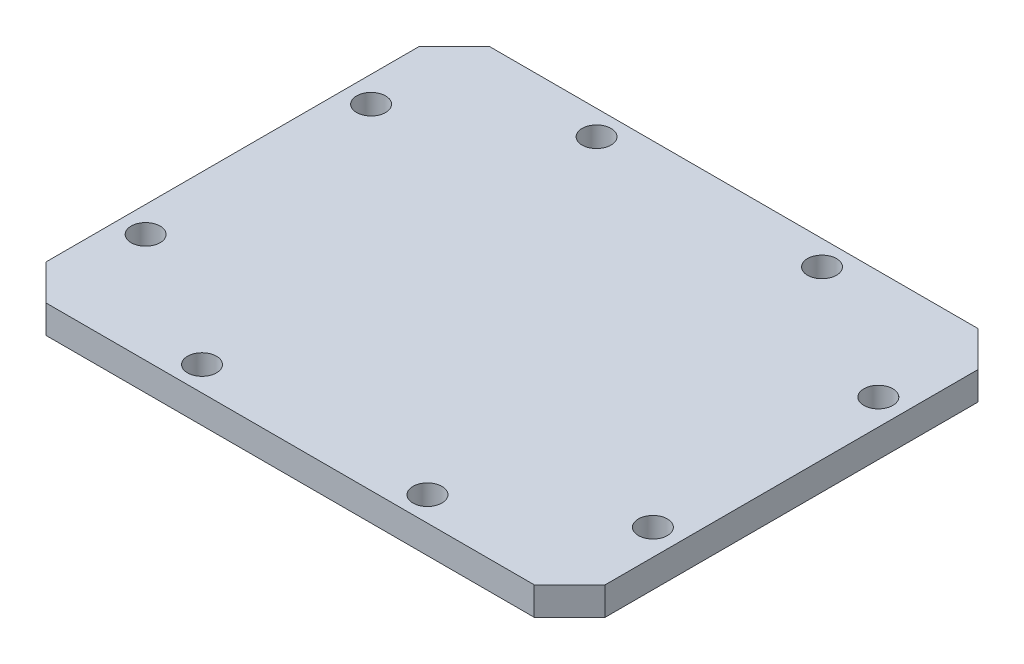
ISO-10303-21;
HEADER;
FILE_DESCRIPTION(('STEP AP214'),'2;1');
FILE_NAME('part.step','',(''),(''),'','','');
FILE_SCHEMA(('AUTOMOTIVE_DESIGN { 1 0 10303 214 1 1 1 1 }'));
ENDSEC;
DATA;
#1=APPLICATION_CONTEXT('core data for automotive mechanical design processes');
#2=APPLICATION_PROTOCOL_DEFINITION('international standard','automotive_design',2000,#1);
#3=PRODUCT_CONTEXT('',#1,'mechanical');
#4=PRODUCT('Part','Part','',(#3));
#5=PRODUCT_RELATED_PRODUCT_CATEGORY('part','',(#4));
#6=PRODUCT_DEFINITION_FORMATION('','',#4);
#7=PRODUCT_DEFINITION_CONTEXT('part definition',#1,'design');
#8=PRODUCT_DEFINITION('design','',#6,#7);
#9=PRODUCT_DEFINITION_SHAPE('','',#8);
#10=(LENGTH_UNIT() NAMED_UNIT(*) SI_UNIT(.MILLI.,.METRE.));
#11=(NAMED_UNIT(*) PLANE_ANGLE_UNIT() SI_UNIT($,.RADIAN.));
#12=(NAMED_UNIT(*) SI_UNIT($,.STERADIAN.) SOLID_ANGLE_UNIT());
#13=UNCERTAINTY_MEASURE_WITH_UNIT(LENGTH_MEASURE(1.E-05),#10,'distance_accuracy_value','');
#14=(GEOMETRIC_REPRESENTATION_CONTEXT(3) GLOBAL_UNCERTAINTY_ASSIGNED_CONTEXT((#13)) GLOBAL_UNIT_ASSIGNED_CONTEXT((#10,
#11,#12)) REPRESENTATION_CONTEXT('',''));
#15=CARTESIAN_POINT('',(0.,0.,0.));
#16=DIRECTION('',(0.,0.,1.));
#17=DIRECTION('',(1.,0.,0.));
#18=AXIS2_PLACEMENT_3D('',#15,#16,#17);
#19=CARTESIAN_POINT('',(0.,3.175,0.));
#20=DIRECTION('',(0.,1.,0.));
#21=DIRECTION('',(0.,0.,1.));
#22=AXIS2_PLACEMENT_3D('',#19,#20,#21);
#23=PLANE('',#22);
#24=CARTESIAN_POINT('',(2.925,3.175,37.7));
#25=DIRECTION('',(0.,1.,0.));
#26=DIRECTION('',(0.,0.,1.));
#27=AXIS2_PLACEMENT_3D('',#24,#25,#26);
#28=CIRCLE('',#27,1.63195);
#29=CARTESIAN_POINT('',(2.925,3.175,39.33195));
#30=VERTEX_POINT('',#29);
#31=EDGE_CURVE('E221',#30,#30,#28,.T.);
#32=ORIENTED_EDGE('',*,*,#31,.F.);
#33=EDGE_LOOP('',(#32));
#34=FACE_BOUND('',#33,.T.);
#35=CARTESIAN_POINT('',(44.2,3.175,47.225));
#36=DIRECTION('',(0.,1.,0.));
#37=DIRECTION('',(0.,0.,1.));
#38=AXIS2_PLACEMENT_3D('',#35,#36,#37);
#39=CIRCLE('',#38,1.63194999999999);
#40=CARTESIAN_POINT('',(44.2,3.175,48.85695));
#41=VERTEX_POINT('',#40);
#42=EDGE_CURVE('E209',#41,#41,#39,.T.);
#43=ORIENTED_EDGE('',*,*,#42,.F.);
#44=EDGE_LOOP('',(#43));
#45=FACE_BOUND('',#44,.T.);
#46=CARTESIAN_POINT('',(60.075,3.175,12.3));
#47=DIRECTION('',(0.,1.,0.));
#48=DIRECTION('',(0.,0.,1.));
#49=AXIS2_PLACEMENT_3D('',#46,#47,#48);
#50=CIRCLE('',#49,1.63195);
#51=CARTESIAN_POINT('',(60.075,3.175,13.93195));
#52=VERTEX_POINT('',#51);
#53=EDGE_CURVE('E197',#52,#52,#50,.T.);
#54=ORIENTED_EDGE('',*,*,#53,.F.);
#55=EDGE_LOOP('',(#54));
#56=FACE_BOUND('',#55,.T.);
#57=CARTESIAN_POINT('',(18.8,3.175,2.775));
#58=DIRECTION('',(0.,1.,0.));
#59=DIRECTION('',(0.,0.,1.));
#60=AXIS2_PLACEMENT_3D('',#57,#58,#59);
#61=CIRCLE('',#60,1.63195);
#62=CARTESIAN_POINT('',(18.8,3.175,4.40695));
#63=VERTEX_POINT('',#62);
#64=EDGE_CURVE('E135',#63,#63,#61,.T.);
#65=ORIENTED_EDGE('',*,*,#64,.F.);
#66=EDGE_LOOP('',(#65));
#67=FACE_BOUND('',#66,.T.);
#68=DIRECTION('',(-1.,0.,0.));
#69=VECTOR('',#68,1.);
#70=CARTESIAN_POINT('',(0.,3.175,0.));
#71=LINE('',#70,#69);
#72=CARTESIAN_POINT('',(59.,3.175,0.));
#73=VERTEX_POINT('',#72);
#74=CARTESIAN_POINT('',(4.,3.175,0.));
#75=VERTEX_POINT('',#74);
#76=EDGE_CURVE('E144',#73,#75,#71,.T.);
#77=ORIENTED_EDGE('',*,*,#76,.T.);
#78=DIRECTION('',(0.707106781186548,0.,-0.707106781186547));
#79=VECTOR('',#78,1.);
#80=CARTESIAN_POINT('',(2.,3.175,2.));
#81=LINE('',#80,#79);
#82=CARTESIAN_POINT('',(0.,3.175,3.99999999999999));
#83=VERTEX_POINT('',#82);
#84=EDGE_CURVE('E162',#75,#83,#81,.F.);
#85=ORIENTED_EDGE('',*,*,#84,.T.);
#86=DIRECTION('',(0.,0.,1.));
#87=VECTOR('',#86,1.);
#88=CARTESIAN_POINT('',(0.,3.175,0.));
#89=LINE('',#88,#87);
#90=CARTESIAN_POINT('',(0.,3.175,46.));
#91=VERTEX_POINT('',#90);
#92=EDGE_CURVE('E126',#83,#91,#89,.T.);
#93=ORIENTED_EDGE('',*,*,#92,.T.);
#94=DIRECTION('',(-0.707106781186547,0.,-0.707106781186548));
#95=VECTOR('',#94,1.);
#96=CARTESIAN_POINT('',(-23.,3.175,23.));
#97=LINE('',#96,#95);
#98=CARTESIAN_POINT('',(4.00000000000001,3.175,50.));
#99=VERTEX_POINT('',#98);
#100=EDGE_CURVE('E158',#91,#99,#97,.F.);
#101=ORIENTED_EDGE('',*,*,#100,.T.);
#102=DIRECTION('',(1.,0.,0.));
#103=VECTOR('',#102,1.);
#104=CARTESIAN_POINT('',(0.,3.175,50.));
#105=LINE('',#104,#103);
#106=CARTESIAN_POINT('',(59.,3.175,50.));
#107=VERTEX_POINT('',#106);
#108=EDGE_CURVE('E171',#99,#107,#105,.T.);
#109=ORIENTED_EDGE('',*,*,#108,.T.);
#110=DIRECTION('',(-0.707106781186549,0.,0.707106781186546));
#111=VECTOR('',#110,1.);
#112=CARTESIAN_POINT('',(54.4999999999999,3.175,54.5000000000001));
#113=LINE('',#112,#111);
#114=CARTESIAN_POINT('',(63.,3.175,46.));
#115=VERTEX_POINT('',#114);
#116=EDGE_CURVE('E61',#107,#115,#113,.F.);
#117=ORIENTED_EDGE('',*,*,#116,.T.);
#118=DIRECTION('',(0.,0.,-1.));
#119=VECTOR('',#118,1.);
#120=CARTESIAN_POINT('',(63.,3.175,0.));
#121=LINE('',#120,#119);
#122=CARTESIAN_POINT('',(63.,3.175,3.99999999999999));
#123=VERTEX_POINT('',#122);
#124=EDGE_CURVE('E177',#115,#123,#121,.T.);
#125=ORIENTED_EDGE('',*,*,#124,.T.);
#126=DIRECTION('',(0.707106781186547,0.,0.707106781186548));
#127=VECTOR('',#126,1.);
#128=CARTESIAN_POINT('',(29.5000000000001,3.175,-29.5));
#129=LINE('',#128,#127);
#130=EDGE_CURVE('E160',#123,#73,#129,.F.);
#131=ORIENTED_EDGE('',*,*,#130,.T.);
#132=EDGE_LOOP('',(#77,#85,#93,#101,#109,#117,#125,#131));
#133=FACE_BOUND('',#132,.T.);
#134=CARTESIAN_POINT('',(44.2,3.175,2.775));
#135=DIRECTION('',(0.,1.,0.));
#136=DIRECTION('',(0.,0.,1.));
#137=AXIS2_PLACEMENT_3D('',#134,#135,#136);
#138=CIRCLE('',#137,1.63195);
#139=CARTESIAN_POINT('',(44.2,3.175,4.40695));
#140=VERTEX_POINT('',#139);
#141=EDGE_CURVE('E192',#140,#140,#138,.T.);
#142=ORIENTED_EDGE('',*,*,#141,.F.);
#143=EDGE_LOOP('',(#142));
#144=FACE_BOUND('',#143,.T.);
#145=CARTESIAN_POINT('',(60.075,3.175,37.7));
#146=DIRECTION('',(0.,1.,0.));
#147=DIRECTION('',(0.,0.,1.));
#148=AXIS2_PLACEMENT_3D('',#145,#146,#147);
#149=CIRCLE('',#148,1.63194999999999);
#150=CARTESIAN_POINT('',(60.075,3.175,39.33195));
#151=VERTEX_POINT('',#150);
#152=EDGE_CURVE('E203',#151,#151,#149,.T.);
#153=ORIENTED_EDGE('',*,*,#152,.F.);
#154=EDGE_LOOP('',(#153));
#155=FACE_BOUND('',#154,.T.);
#156=CARTESIAN_POINT('',(18.8,3.175,47.225));
#157=DIRECTION('',(0.,1.,0.));
#158=DIRECTION('',(0.,0.,1.));
#159=AXIS2_PLACEMENT_3D('',#156,#157,#158);
#160=CIRCLE('',#159,1.63195);
#161=CARTESIAN_POINT('',(18.8,3.175,48.85695));
#162=VERTEX_POINT('',#161);
#163=EDGE_CURVE('E215',#162,#162,#160,.T.);
#164=ORIENTED_EDGE('',*,*,#163,.F.);
#165=EDGE_LOOP('',(#164));
#166=FACE_BOUND('',#165,.T.);
#167=CARTESIAN_POINT('',(2.925,3.175,12.3));
#168=DIRECTION('',(0.,1.,0.));
#169=DIRECTION('',(0.,0.,1.));
#170=AXIS2_PLACEMENT_3D('',#167,#168,#169);
#171=CIRCLE('',#170,1.63195);
#172=CARTESIAN_POINT('',(2.925,3.175,13.93195));
#173=VERTEX_POINT('',#172);
#174=EDGE_CURVE('E227',#173,#173,#171,.T.);
#175=ORIENTED_EDGE('',*,*,#174,.F.);
#176=EDGE_LOOP('',(#175));
#177=FACE_BOUND('',#176,.T.);
#178=ADVANCED_FACE('F38',(#34,#45,#56,#67,#133,#144,#155,#166,#177),#23,.T.);
#179=CARTESIAN_POINT('',(0.,0.,0.));
#180=DIRECTION('',(0.,1.,0.));
#181=DIRECTION('',(0.,0.,1.));
#182=AXIS2_PLACEMENT_3D('',#179,#180,#181);
#183=PLANE('',#182);
#184=DIRECTION('',(0.,0.,1.));
#185=VECTOR('',#184,1.);
#186=CARTESIAN_POINT('',(0.,0.,0.));
#187=LINE('',#186,#185);
#188=CARTESIAN_POINT('',(0.,0.,3.99999999999999));
#189=VERTEX_POINT('',#188);
#190=CARTESIAN_POINT('',(0.,0.,46.));
#191=VERTEX_POINT('',#190);
#192=EDGE_CURVE('E123',#189,#191,#187,.T.);
#193=ORIENTED_EDGE('',*,*,#192,.F.);
#194=DIRECTION('',(-0.707106781186548,0.,0.707106781186547));
#195=VECTOR('',#194,1.);
#196=CARTESIAN_POINT('',(0.,0.,3.99999999999999));
#197=LINE('',#196,#195);
#198=CARTESIAN_POINT('',(4.,0.,0.));
#199=VERTEX_POINT('',#198);
#200=EDGE_CURVE('E106',#189,#199,#197,.F.);
#201=ORIENTED_EDGE('',*,*,#200,.T.);
#202=DIRECTION('',(-1.,0.,0.));
#203=VECTOR('',#202,1.);
#204=CARTESIAN_POINT('',(0.,0.,0.));
#205=LINE('',#204,#203);
#206=CARTESIAN_POINT('',(59.,0.,0.));
#207=VERTEX_POINT('',#206);
#208=EDGE_CURVE('E148',#207,#199,#205,.T.);
#209=ORIENTED_EDGE('',*,*,#208,.F.);
#210=DIRECTION('',(-0.707106781186547,0.,-0.707106781186548));
#211=VECTOR('',#210,1.);
#212=CARTESIAN_POINT('',(59.,0.,0.));
#213=LINE('',#212,#211);
#214=CARTESIAN_POINT('',(63.,0.,3.99999999999999));
#215=VERTEX_POINT('',#214);
#216=EDGE_CURVE('E117',#207,#215,#213,.F.);
#217=ORIENTED_EDGE('',*,*,#216,.T.);
#218=DIRECTION('',(0.,0.,-1.));
#219=VECTOR('',#218,1.);
#220=CARTESIAN_POINT('',(63.,0.,0.));
#221=LINE('',#220,#219);
#222=CARTESIAN_POINT('',(63.,0.,46.));
#223=VERTEX_POINT('',#222);
#224=EDGE_CURVE('E138',#223,#215,#221,.T.);
#225=ORIENTED_EDGE('',*,*,#224,.F.);
#226=DIRECTION('',(0.707106781186549,0.,-0.707106781186546));
#227=VECTOR('',#226,1.);
#228=CARTESIAN_POINT('',(63.,0.,46.));
#229=LINE('',#228,#227);
#230=CARTESIAN_POINT('',(59.,0.,50.));
#231=VERTEX_POINT('',#230);
#232=EDGE_CURVE('E127',#223,#231,#229,.F.);
#233=ORIENTED_EDGE('',*,*,#232,.T.);
#234=DIRECTION('',(1.,0.,0.));
#235=VECTOR('',#234,1.);
#236=CARTESIAN_POINT('',(0.,0.,50.));
#237=LINE('',#236,#235);
#238=CARTESIAN_POINT('',(4.00000000000001,0.,50.));
#239=VERTEX_POINT('',#238);
#240=EDGE_CURVE('E134',#239,#231,#237,.T.);
#241=ORIENTED_EDGE('',*,*,#240,.F.);
#242=DIRECTION('',(0.707106781186547,0.,0.707106781186548));
#243=VECTOR('',#242,1.);
#244=CARTESIAN_POINT('',(4.00000000000001,0.,50.));
#245=LINE('',#244,#243);
#246=EDGE_CURVE('E133',#239,#191,#245,.F.);
#247=ORIENTED_EDGE('',*,*,#246,.T.);
#248=EDGE_LOOP('',(#193,#201,#209,#217,#225,#233,#241,#247));
#249=FACE_BOUND('',#248,.T.);
#250=CARTESIAN_POINT('',(18.8,0.,2.775));
#251=DIRECTION('',(0.,1.,0.));
#252=DIRECTION('',(0.,0.,1.));
#253=AXIS2_PLACEMENT_3D('',#250,#251,#252);
#254=CIRCLE('',#253,1.63195);
#255=CARTESIAN_POINT('',(18.8,0.,4.40695));
#256=VERTEX_POINT('',#255);
#257=EDGE_CURVE('E141',#256,#256,#254,.T.);
#258=ORIENTED_EDGE('',*,*,#257,.T.);
#259=EDGE_LOOP('',(#258));
#260=FACE_BOUND('',#259,.T.);
#261=CARTESIAN_POINT('',(44.2,0.,2.775));
#262=DIRECTION('',(0.,1.,0.));
#263=DIRECTION('',(0.,0.,1.));
#264=AXIS2_PLACEMENT_3D('',#261,#262,#263);
#265=CIRCLE('',#264,1.63195);
#266=CARTESIAN_POINT('',(44.2,0.,4.40695));
#267=VERTEX_POINT('',#266);
#268=EDGE_CURVE('E194',#267,#267,#265,.T.);
#269=ORIENTED_EDGE('',*,*,#268,.T.);
#270=EDGE_LOOP('',(#269));
#271=FACE_BOUND('',#270,.T.);
#272=CARTESIAN_POINT('',(60.075,0.,12.3));
#273=DIRECTION('',(0.,1.,0.));
#274=DIRECTION('',(0.,0.,1.));
#275=AXIS2_PLACEMENT_3D('',#272,#273,#274);
#276=CIRCLE('',#275,1.63195);
#277=CARTESIAN_POINT('',(60.075,0.,13.93195));
#278=VERTEX_POINT('',#277);
#279=EDGE_CURVE('E200',#278,#278,#276,.T.);
#280=ORIENTED_EDGE('',*,*,#279,.T.);
#281=EDGE_LOOP('',(#280));
#282=FACE_BOUND('',#281,.T.);
#283=CARTESIAN_POINT('',(60.075,0.,37.7));
#284=DIRECTION('',(0.,1.,0.));
#285=DIRECTION('',(0.,0.,1.));
#286=AXIS2_PLACEMENT_3D('',#283,#284,#285);
#287=CIRCLE('',#286,1.63194999999999);
#288=CARTESIAN_POINT('',(60.075,0.,39.33195));
#289=VERTEX_POINT('',#288);
#290=EDGE_CURVE('E206',#289,#289,#287,.T.);
#291=ORIENTED_EDGE('',*,*,#290,.T.);
#292=EDGE_LOOP('',(#291));
#293=FACE_BOUND('',#292,.T.);
#294=CARTESIAN_POINT('',(44.2,0.,47.225));
#295=DIRECTION('',(0.,1.,0.));
#296=DIRECTION('',(0.,0.,1.));
#297=AXIS2_PLACEMENT_3D('',#294,#295,#296);
#298=CIRCLE('',#297,1.63194999999999);
#299=CARTESIAN_POINT('',(44.2,0.,48.85695));
#300=VERTEX_POINT('',#299);
#301=EDGE_CURVE('E212',#300,#300,#298,.T.);
#302=ORIENTED_EDGE('',*,*,#301,.T.);
#303=EDGE_LOOP('',(#302));
#304=FACE_BOUND('',#303,.T.);
#305=CARTESIAN_POINT('',(18.8,0.,47.225));
#306=DIRECTION('',(0.,1.,0.));
#307=DIRECTION('',(0.,0.,1.));
#308=AXIS2_PLACEMENT_3D('',#305,#306,#307);
#309=CIRCLE('',#308,1.63195);
#310=CARTESIAN_POINT('',(18.8,0.,48.85695));
#311=VERTEX_POINT('',#310);
#312=EDGE_CURVE('E218',#311,#311,#309,.T.);
#313=ORIENTED_EDGE('',*,*,#312,.T.);
#314=EDGE_LOOP('',(#313));
#315=FACE_BOUND('',#314,.T.);
#316=CARTESIAN_POINT('',(2.925,0.,37.7));
#317=DIRECTION('',(0.,1.,0.));
#318=DIRECTION('',(0.,0.,1.));
#319=AXIS2_PLACEMENT_3D('',#316,#317,#318);
#320=CIRCLE('',#319,1.63195);
#321=CARTESIAN_POINT('',(2.925,0.,39.33195));
#322=VERTEX_POINT('',#321);
#323=EDGE_CURVE('E224',#322,#322,#320,.T.);
#324=ORIENTED_EDGE('',*,*,#323,.T.);
#325=EDGE_LOOP('',(#324));
#326=FACE_BOUND('',#325,.T.);
#327=CARTESIAN_POINT('',(2.925,0.,12.3));
#328=DIRECTION('',(0.,1.,0.));
#329=DIRECTION('',(0.,0.,1.));
#330=AXIS2_PLACEMENT_3D('',#327,#328,#329);
#331=CIRCLE('',#330,1.63195);
#332=CARTESIAN_POINT('',(2.925,0.,13.93195));
#333=VERTEX_POINT('',#332);
#334=EDGE_CURVE('E230',#333,#333,#331,.T.);
#335=ORIENTED_EDGE('',*,*,#334,.T.);
#336=EDGE_LOOP('',(#335));
#337=FACE_BOUND('',#336,.T.);
#338=ADVANCED_FACE('F130',(#249,#260,#271,#282,#293,#304,#315,#326,#337),#183,.F.);
#339=CARTESIAN_POINT('',(0.,3.175,0.));
#340=DIRECTION('',(1.,0.,0.));
#341=DIRECTION('',(0.,0.,-1.));
#342=AXIS2_PLACEMENT_3D('',#339,#340,#341);
#343=PLANE('',#342);
#344=ORIENTED_EDGE('',*,*,#92,.F.);
#345=DIRECTION('',(0.,-1.,0.));
#346=VECTOR('',#345,1.);
#347=CARTESIAN_POINT('',(0.,3.175,3.99999999999999));
#348=LINE('',#347,#346);
#349=EDGE_CURVE('E110',#83,#189,#348,.T.);
#350=ORIENTED_EDGE('',*,*,#349,.T.);
#351=ORIENTED_EDGE('',*,*,#192,.T.);
#352=DIRECTION('',(0.,1.,0.));
#353=VECTOR('',#352,1.);
#354=CARTESIAN_POINT('',(0.,3.175,46.));
#355=LINE('',#354,#353);
#356=EDGE_CURVE('E128',#191,#91,#355,.T.);
#357=ORIENTED_EDGE('',*,*,#356,.T.);
#358=EDGE_LOOP('',(#344,#350,#351,#357));
#359=FACE_BOUND('',#358,.T.);
#360=ADVANCED_FACE('F122',(#359),#343,.F.);
#361=CARTESIAN_POINT('',(0.,3.175,50.));
#362=DIRECTION('',(0.,0.,-1.));
#363=DIRECTION('',(-1.,0.,0.));
#364=AXIS2_PLACEMENT_3D('',#361,#362,#363);
#365=PLANE('',#364);
#366=ORIENTED_EDGE('',*,*,#108,.F.);
#367=DIRECTION('',(0.,-1.,0.));
#368=VECTOR('',#367,1.);
#369=CARTESIAN_POINT('',(4.00000000000001,3.175,50.));
#370=LINE('',#369,#368);
#371=EDGE_CURVE('E11',#99,#239,#370,.T.);
#372=ORIENTED_EDGE('',*,*,#371,.T.);
#373=ORIENTED_EDGE('',*,*,#240,.T.);
#374=DIRECTION('',(0.,1.,0.));
#375=VECTOR('',#374,1.);
#376=CARTESIAN_POINT('',(59.,3.175,50.));
#377=LINE('',#376,#375);
#378=EDGE_CURVE('E47',#231,#107,#377,.T.);
#379=ORIENTED_EDGE('',*,*,#378,.T.);
#380=EDGE_LOOP('',(#366,#372,#373,#379));
#381=FACE_BOUND('',#380,.T.);
#382=ADVANCED_FACE('F170',(#381),#365,.F.);
#383=CARTESIAN_POINT('',(63.,3.175,0.));
#384=DIRECTION('',(-1.,0.,0.));
#385=DIRECTION('',(0.,0.,1.));
#386=AXIS2_PLACEMENT_3D('',#383,#384,#385);
#387=PLANE('',#386);
#388=ORIENTED_EDGE('',*,*,#224,.T.);
#389=DIRECTION('',(0.,1.,0.));
#390=VECTOR('',#389,1.);
#391=CARTESIAN_POINT('',(63.,3.175,3.99999999999999));
#392=LINE('',#391,#390);
#393=EDGE_CURVE('E54',#215,#123,#392,.T.);
#394=ORIENTED_EDGE('',*,*,#393,.T.);
#395=ORIENTED_EDGE('',*,*,#124,.F.);
#396=DIRECTION('',(0.,-1.,0.));
#397=VECTOR('',#396,1.);
#398=CARTESIAN_POINT('',(63.,3.175,46.));
#399=LINE('',#398,#397);
#400=EDGE_CURVE('E164',#115,#223,#399,.T.);
#401=ORIENTED_EDGE('',*,*,#400,.T.);
#402=EDGE_LOOP('',(#388,#394,#395,#401));
#403=FACE_BOUND('',#402,.T.);
#404=ADVANCED_FACE('F181',(#403),#387,.F.);
#405=CARTESIAN_POINT('',(0.,3.175,0.));
#406=DIRECTION('',(0.,0.,1.));
#407=DIRECTION('',(1.,0.,0.));
#408=AXIS2_PLACEMENT_3D('',#405,#406,#407);
#409=PLANE('',#408);
#410=ORIENTED_EDGE('',*,*,#208,.T.);
#411=DIRECTION('',(0.,1.,0.));
#412=VECTOR('',#411,1.);
#413=CARTESIAN_POINT('',(4.,3.175,0.));
#414=LINE('',#413,#412);
#415=EDGE_CURVE('E111',#199,#75,#414,.T.);
#416=ORIENTED_EDGE('',*,*,#415,.T.);
#417=ORIENTED_EDGE('',*,*,#76,.F.);
#418=DIRECTION('',(0.,-1.,0.));
#419=VECTOR('',#418,1.);
#420=CARTESIAN_POINT('',(59.,3.175,0.));
#421=LINE('',#420,#419);
#422=EDGE_CURVE('E116',#73,#207,#421,.T.);
#423=ORIENTED_EDGE('',*,*,#422,.T.);
#424=EDGE_LOOP('',(#410,#416,#417,#423));
#425=FACE_BOUND('',#424,.T.);
#426=ADVANCED_FACE('F188',(#425),#409,.F.);
#427=CARTESIAN_POINT('',(18.8,3.175,2.775));
#428=DIRECTION('',(0.,-1.,0.));
#429=DIRECTION('',(0.,0.,-1.));
#430=AXIS2_PLACEMENT_3D('',#427,#428,#429);
#431=CYLINDRICAL_SURFACE('',#430,1.63195);
#432=ORIENTED_EDGE('',*,*,#64,.T.);
#433=EDGE_LOOP('',(#432));
#434=FACE_BOUND('',#433,.T.);
#435=ORIENTED_EDGE('',*,*,#257,.F.);
#436=EDGE_LOOP('',(#435));
#437=FACE_BOUND('',#436,.T.);
#438=ADVANCED_FACE('F249',(#434,#437),#431,.F.);
#439=CARTESIAN_POINT('',(44.2,3.175,2.775));
#440=DIRECTION('',(0.,-1.,0.));
#441=DIRECTION('',(0.,0.,-1.));
#442=AXIS2_PLACEMENT_3D('',#439,#440,#441);
#443=CYLINDRICAL_SURFACE('',#442,1.63195);
#444=ORIENTED_EDGE('',*,*,#141,.T.);
#445=EDGE_LOOP('',(#444));
#446=FACE_BOUND('',#445,.T.);
#447=ORIENTED_EDGE('',*,*,#268,.F.);
#448=EDGE_LOOP('',(#447));
#449=FACE_BOUND('',#448,.T.);
#450=ADVANCED_FACE('F390',(#446,#449),#443,.F.);
#451=CARTESIAN_POINT('',(60.075,3.175,12.3));
#452=DIRECTION('',(0.,-1.,0.));
#453=DIRECTION('',(0.,0.,-1.));
#454=AXIS2_PLACEMENT_3D('',#451,#452,#453);
#455=CYLINDRICAL_SURFACE('',#454,1.63195);
#456=ORIENTED_EDGE('',*,*,#53,.T.);
#457=EDGE_LOOP('',(#456));
#458=FACE_BOUND('',#457,.T.);
#459=ORIENTED_EDGE('',*,*,#279,.F.);
#460=EDGE_LOOP('',(#459));
#461=FACE_BOUND('',#460,.T.);
#462=ADVANCED_FACE('F380',(#458,#461),#455,.F.);
#463=CARTESIAN_POINT('',(60.075,3.175,37.7));
#464=DIRECTION('',(0.,-1.,0.));
#465=DIRECTION('',(0.,0.,-1.));
#466=AXIS2_PLACEMENT_3D('',#463,#464,#465);
#467=CYLINDRICAL_SURFACE('',#466,1.63194999999999);
#468=ORIENTED_EDGE('',*,*,#152,.T.);
#469=EDGE_LOOP('',(#468));
#470=FACE_BOUND('',#469,.T.);
#471=ORIENTED_EDGE('',*,*,#290,.F.);
#472=EDGE_LOOP('',(#471));
#473=FACE_BOUND('',#472,.T.);
#474=ADVANCED_FACE('F370',(#470,#473),#467,.F.);
#475=CARTESIAN_POINT('',(44.2,3.175,47.225));
#476=DIRECTION('',(0.,-1.,0.));
#477=DIRECTION('',(0.,0.,-1.));
#478=AXIS2_PLACEMENT_3D('',#475,#476,#477);
#479=CYLINDRICAL_SURFACE('',#478,1.63194999999999);
#480=ORIENTED_EDGE('',*,*,#42,.T.);
#481=EDGE_LOOP('',(#480));
#482=FACE_BOUND('',#481,.T.);
#483=ORIENTED_EDGE('',*,*,#301,.F.);
#484=EDGE_LOOP('',(#483));
#485=FACE_BOUND('',#484,.T.);
#486=ADVANCED_FACE('F360',(#482,#485),#479,.F.);
#487=CARTESIAN_POINT('',(18.8,3.175,47.225));
#488=DIRECTION('',(0.,-1.,0.));
#489=DIRECTION('',(0.,0.,-1.));
#490=AXIS2_PLACEMENT_3D('',#487,#488,#489);
#491=CYLINDRICAL_SURFACE('',#490,1.63195);
#492=ORIENTED_EDGE('',*,*,#163,.T.);
#493=EDGE_LOOP('',(#492));
#494=FACE_BOUND('',#493,.T.);
#495=ORIENTED_EDGE('',*,*,#312,.F.);
#496=EDGE_LOOP('',(#495));
#497=FACE_BOUND('',#496,.T.);
#498=ADVANCED_FACE('F350',(#494,#497),#491,.F.);
#499=CARTESIAN_POINT('',(2.925,3.175,37.7));
#500=DIRECTION('',(0.,-1.,0.));
#501=DIRECTION('',(0.,0.,-1.));
#502=AXIS2_PLACEMENT_3D('',#499,#500,#501);
#503=CYLINDRICAL_SURFACE('',#502,1.63195);
#504=ORIENTED_EDGE('',*,*,#31,.T.);
#505=EDGE_LOOP('',(#504));
#506=FACE_BOUND('',#505,.T.);
#507=ORIENTED_EDGE('',*,*,#323,.F.);
#508=EDGE_LOOP('',(#507));
#509=FACE_BOUND('',#508,.T.);
#510=ADVANCED_FACE('F341',(#506,#509),#503,.F.);
#511=CARTESIAN_POINT('',(2.925,3.175,12.3));
#512=DIRECTION('',(0.,-1.,0.));
#513=DIRECTION('',(0.,0.,-1.));
#514=AXIS2_PLACEMENT_3D('',#511,#512,#513);
#515=CYLINDRICAL_SURFACE('',#514,1.63195);
#516=ORIENTED_EDGE('',*,*,#174,.T.);
#517=EDGE_LOOP('',(#516));
#518=FACE_BOUND('',#517,.T.);
#519=ORIENTED_EDGE('',*,*,#334,.F.);
#520=EDGE_LOOP('',(#519));
#521=FACE_BOUND('',#520,.T.);
#522=ADVANCED_FACE('F236',(#518,#521),#515,.F.);
#523=CARTESIAN_POINT('',(0.,3.175,3.99999999999999));
#524=DIRECTION('',(0.707106781186547,0.,0.707106781186548));
#525=DIRECTION('',(0.,-1.,0.));
#526=AXIS2_PLACEMENT_3D('',#523,#524,#525);
#527=PLANE('',#526);
#528=ORIENTED_EDGE('',*,*,#84,.F.);
#529=ORIENTED_EDGE('',*,*,#415,.F.);
#530=ORIENTED_EDGE('',*,*,#200,.F.);
#531=ORIENTED_EDGE('',*,*,#349,.F.);
#532=EDGE_LOOP('',(#528,#529,#530,#531));
#533=FACE_BOUND('',#532,.T.);
#534=ADVANCED_FACE('F109',(#533),#527,.F.);
#535=CARTESIAN_POINT('',(59.,3.175,0.));
#536=DIRECTION('',(-0.707106781186548,0.,0.707106781186547));
#537=DIRECTION('',(0.,-1.,0.));
#538=AXIS2_PLACEMENT_3D('',#535,#536,#537);
#539=PLANE('',#538);
#540=ORIENTED_EDGE('',*,*,#130,.F.);
#541=ORIENTED_EDGE('',*,*,#393,.F.);
#542=ORIENTED_EDGE('',*,*,#216,.F.);
#543=ORIENTED_EDGE('',*,*,#422,.F.);
#544=EDGE_LOOP('',(#540,#541,#542,#543));
#545=FACE_BOUND('',#544,.T.);
#546=ADVANCED_FACE('F185',(#545),#539,.F.);
#547=CARTESIAN_POINT('',(4.00000000000001,3.175,50.));
#548=DIRECTION('',(0.707106781186548,0.,-0.707106781186547));
#549=DIRECTION('',(0.,-1.,0.));
#550=AXIS2_PLACEMENT_3D('',#547,#548,#549);
#551=PLANE('',#550);
#552=ORIENTED_EDGE('',*,*,#100,.F.);
#553=ORIENTED_EDGE('',*,*,#356,.F.);
#554=ORIENTED_EDGE('',*,*,#246,.F.);
#555=ORIENTED_EDGE('',*,*,#371,.F.);
#556=EDGE_LOOP('',(#552,#553,#554,#555));
#557=FACE_BOUND('',#556,.T.);
#558=ADVANCED_FACE('F270',(#557),#551,.F.);
#559=CARTESIAN_POINT('',(63.,3.175,46.));
#560=DIRECTION('',(-0.707106781186546,0.,-0.707106781186549));
#561=DIRECTION('',(0.,-1.,0.));
#562=AXIS2_PLACEMENT_3D('',#559,#560,#561);
#563=PLANE('',#562);
#564=ORIENTED_EDGE('',*,*,#116,.F.);
#565=ORIENTED_EDGE('',*,*,#378,.F.);
#566=ORIENTED_EDGE('',*,*,#232,.F.);
#567=ORIENTED_EDGE('',*,*,#400,.F.);
#568=EDGE_LOOP('',(#564,#565,#566,#567));
#569=FACE_BOUND('',#568,.T.);
#570=ADVANCED_FACE('F41',(#569),#563,.F.);
#571=CLOSED_SHELL('',(#178,#338,#360,#382,#404,#426,#438,#450,#462,#474,#486,#498,#510,#522,
#534,#546,#558,#570));
#572=MANIFOLD_SOLID_BREP('B2',#571);
#573=ADVANCED_BREP_SHAPE_REPRESENTATION('',(#18,#572),#14);
#574=SHAPE_DEFINITION_REPRESENTATION(#9,#573);
ENDSEC;
END-ISO-10303-21;
